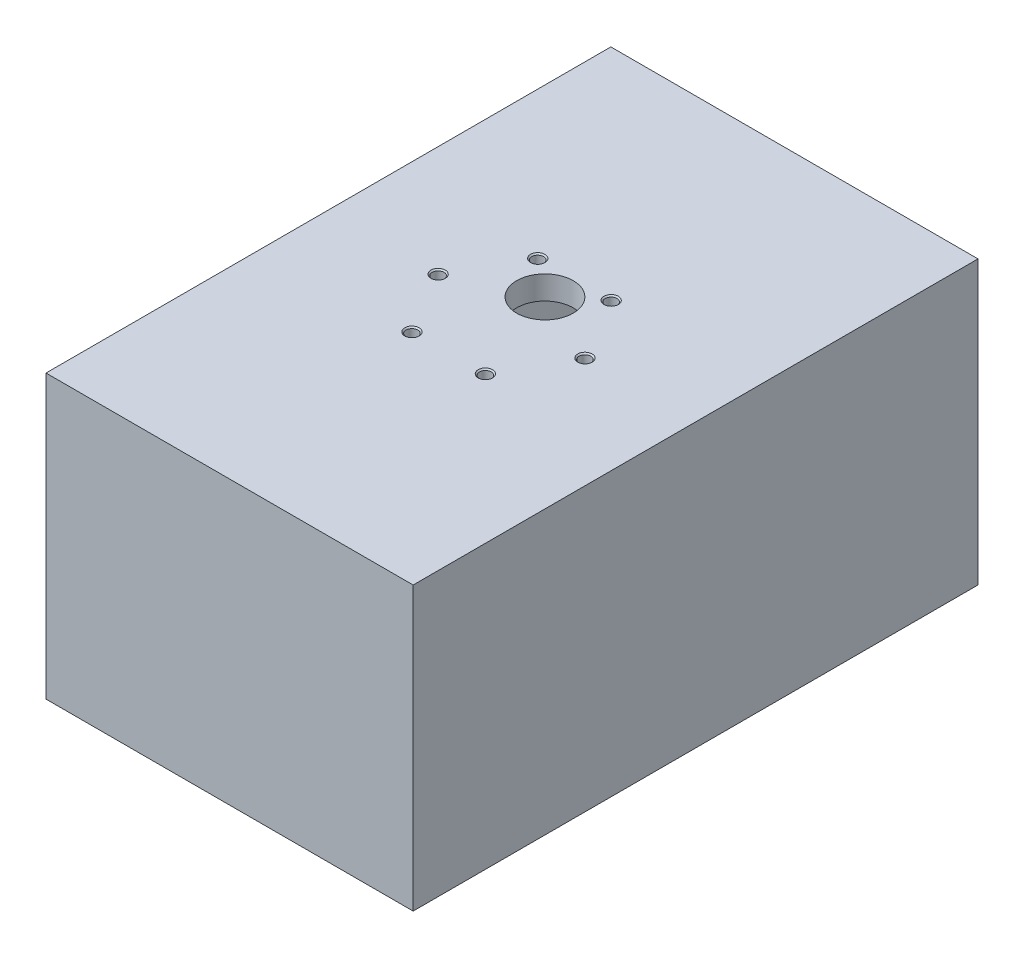
ISO-10303-21;
HEADER;
FILE_DESCRIPTION(('STEP AP214'),'2;1');
FILE_NAME('part.step','',(''),(''),'','','');
FILE_SCHEMA(('AUTOMOTIVE_DESIGN { 1 0 10303 214 1 1 1 1 }'));
ENDSEC;
DATA;
#1=APPLICATION_CONTEXT('core data for automotive mechanical design processes');
#2=APPLICATION_PROTOCOL_DEFINITION('international standard','automotive_design',2000,#1);
#3=PRODUCT_CONTEXT('',#1,'mechanical');
#4=PRODUCT('Part','Part','',(#3));
#5=PRODUCT_RELATED_PRODUCT_CATEGORY('part','',(#4));
#6=PRODUCT_DEFINITION_FORMATION('','',#4);
#7=PRODUCT_DEFINITION_CONTEXT('part definition',#1,'design');
#8=PRODUCT_DEFINITION('design','',#6,#7);
#9=PRODUCT_DEFINITION_SHAPE('','',#8);
#10=(LENGTH_UNIT() NAMED_UNIT(*) SI_UNIT(.MILLI.,.METRE.));
#11=(NAMED_UNIT(*) PLANE_ANGLE_UNIT() SI_UNIT($,.RADIAN.));
#12=(NAMED_UNIT(*) SI_UNIT($,.STERADIAN.) SOLID_ANGLE_UNIT());
#13=UNCERTAINTY_MEASURE_WITH_UNIT(LENGTH_MEASURE(1.E-05),#10,'distance_accuracy_value','');
#14=(GEOMETRIC_REPRESENTATION_CONTEXT(3) GLOBAL_UNCERTAINTY_ASSIGNED_CONTEXT((#13)) GLOBAL_UNIT_ASSIGNED_CONTEXT((#10,
#11,#12)) REPRESENTATION_CONTEXT('',''));
#15=CARTESIAN_POINT('',(0.,0.,0.));
#16=DIRECTION('',(0.,0.,1.));
#17=DIRECTION('',(1.,0.,0.));
#18=AXIS2_PLACEMENT_3D('',#15,#16,#17);
#19=CARTESIAN_POINT('',(0.,60.,0.));
#20=DIRECTION('',(0.,1.,0.));
#21=DIRECTION('',(0.,0.,1.));
#22=AXIS2_PLACEMENT_3D('',#19,#20,#21);
#23=PLANE('',#22);
#24=CARTESIAN_POINT('',(7.81807584834448,60.,13.476850013281));
#25=DIRECTION('',(0.,1.,0.));
#26=DIRECTION('',(-0.866025403784433,0.,0.50000000000001));
#27=AXIS2_PLACEMENT_3D('',#24,#25,#26);
#28=CIRCLE('',#27,1.525);
#29=CARTESIAN_POINT('',(6.49738710757322,60.,14.239350013281));
#30=VERTEX_POINT('',#29);
#31=EDGE_CURVE('E234',#30,#30,#28,.T.);
#32=ORIENTED_EDGE('',*,*,#31,.F.);
#33=EDGE_LOOP('',(#32));
#34=FACE_BOUND('',#33,.T.);
#35=CARTESIAN_POINT('',(-7.69418070197745,60.,13.5625335546426));
#36=DIRECTION('',(0.,1.,0.));
#37=DIRECTION('',(-0.866025403784443,0.,-0.499999999999992));
#38=AXIS2_PLACEMENT_3D('',#35,#36,#37);
#39=CIRCLE('',#38,1.525);
#40=CARTESIAN_POINT('',(-9.01486944274872,60.,12.8000335546426));
#41=VERTEX_POINT('',#40);
#42=EDGE_CURVE('E238',#41,#41,#39,.T.);
#43=ORIENTED_EDGE('',*,*,#42,.F.);
#44=EDGE_LOOP('',(#43));
#45=FACE_BOUND('',#44,.T.);
#46=CARTESIAN_POINT('',(-15.5245131006438,60.,0.171367082722987));
#47=DIRECTION('',(0.,1.,0.));
#48=DIRECTION('',(0.,0.,-1.));
#49=AXIS2_PLACEMENT_3D('',#46,#47,#48);
#50=CIRCLE('',#49,1.525);
#51=CARTESIAN_POINT('',(-15.5245131006438,60.,-1.35363291727701));
#52=VERTEX_POINT('',#51);
#53=EDGE_CURVE('E242',#52,#52,#50,.T.);
#54=ORIENTED_EDGE('',*,*,#53,.F.);
#55=EDGE_LOOP('',(#54));
#56=FACE_BOUND('',#55,.T.);
#57=CARTESIAN_POINT('',(-7.84258894898817,60.,-13.305482930558));
#58=DIRECTION('',(0.,1.,0.));
#59=DIRECTION('',(0.866025403784436,0.,-0.500000000000004));
#60=AXIS2_PLACEMENT_3D('',#57,#58,#59);
#61=CIRCLE('',#60,1.525);
#62=CARTESIAN_POINT('',(-6.52190020821691,60.,-14.0679829305581));
#63=VERTEX_POINT('',#62);
#64=EDGE_CURVE('E246',#63,#63,#61,.T.);
#65=ORIENTED_EDGE('',*,*,#64,.F.);
#66=EDGE_LOOP('',(#65));
#67=FACE_BOUND('',#66,.T.);
#68=CARTESIAN_POINT('',(7.66966760133375,60.,-13.3911664719196));
#69=DIRECTION('',(0.,1.,0.));
#70=DIRECTION('',(0.86602540378444,0.,0.499999999999998));
#71=AXIS2_PLACEMENT_3D('',#68,#69,#70);
#72=CIRCLE('',#71,1.525);
#73=CARTESIAN_POINT('',(8.99035634210502,60.,-12.6286664719196));
#74=VERTEX_POINT('',#73);
#75=EDGE_CURVE('E250',#74,#74,#72,.T.);
#76=ORIENTED_EDGE('',*,*,#75,.F.);
#77=EDGE_LOOP('',(#76));
#78=FACE_BOUND('',#77,.T.);
#79=CARTESIAN_POINT('',(15.5,60.,0.));
#80=DIRECTION('',(0.,1.,0.));
#81=DIRECTION('',(0.,0.,1.));
#82=AXIS2_PLACEMENT_3D('',#79,#80,#81);
#83=CIRCLE('',#82,1.525);
#84=CARTESIAN_POINT('',(15.5,60.,1.525));
#85=VERTEX_POINT('',#84);
#86=EDGE_CURVE('E254',#85,#85,#83,.T.);
#87=ORIENTED_EDGE('',*,*,#86,.F.);
#88=EDGE_LOOP('',(#87));
#89=FACE_BOUND('',#88,.T.);
#90=CARTESIAN_POINT('',(0.,60.,-7.));
#91=DIRECTION('',(0.,1.,0.));
#92=DIRECTION('',(0.,0.,1.));
#93=AXIS2_PLACEMENT_3D('',#90,#91,#92);
#94=CIRCLE('',#93,6.);
#95=CARTESIAN_POINT('',(0.,60.,-1.));
#96=VERTEX_POINT('',#95);
#97=EDGE_CURVE('E185',#96,#96,#94,.T.);
#98=ORIENTED_EDGE('',*,*,#97,.F.);
#99=EDGE_LOOP('',(#98));
#100=FACE_BOUND('',#99,.T.);
#101=DIRECTION('',(-1.,0.,0.));
#102=VECTOR('',#101,1.);
#103=CARTESIAN_POINT('',(39.,60.,-60.));
#104=LINE('',#103,#102);
#105=CARTESIAN_POINT('',(39.,60.,-60.));
#106=VERTEX_POINT('',#105);
#107=CARTESIAN_POINT('',(-39.,60.,-60.));
#108=VERTEX_POINT('',#107);
#109=EDGE_CURVE('E163',#106,#108,#104,.T.);
#110=ORIENTED_EDGE('',*,*,#109,.T.);
#111=DIRECTION('',(0.,0.,1.));
#112=VECTOR('',#111,1.);
#113=CARTESIAN_POINT('',(-39.,60.,-60.));
#114=LINE('',#113,#112);
#115=CARTESIAN_POINT('',(-39.,60.,60.));
#116=VERTEX_POINT('',#115);
#117=EDGE_CURVE('E94',#108,#116,#114,.T.);
#118=ORIENTED_EDGE('',*,*,#117,.T.);
#119=DIRECTION('',(1.,0.,0.));
#120=VECTOR('',#119,1.);
#121=CARTESIAN_POINT('',(39.,60.,60.));
#122=LINE('',#121,#120);
#123=CARTESIAN_POINT('',(39.,60.,60.));
#124=VERTEX_POINT('',#123);
#125=EDGE_CURVE('E173',#116,#124,#122,.T.);
#126=ORIENTED_EDGE('',*,*,#125,.T.);
#127=DIRECTION('',(0.,0.,-1.));
#128=VECTOR('',#127,1.);
#129=CARTESIAN_POINT('',(39.,60.,-60.));
#130=LINE('',#129,#128);
#131=EDGE_CURVE('E176',#124,#106,#130,.T.);
#132=ORIENTED_EDGE('',*,*,#131,.T.);
#133=EDGE_LOOP('',(#110,#118,#126,#132));
#134=FACE_BOUND('',#133,.T.);
#135=ADVANCED_FACE('F51',(#34,#45,#56,#67,#78,#89,#100,#134),#23,.T.);
#136=CARTESIAN_POINT('',(0.,0.,0.));
#137=DIRECTION('',(0.,1.,0.));
#138=DIRECTION('',(0.,0.,1.));
#139=AXIS2_PLACEMENT_3D('',#136,#137,#138);
#140=PLANE('',#139);
#141=DIRECTION('',(0.,0.,1.));
#142=VECTOR('',#141,1.);
#143=CARTESIAN_POINT('',(-34.,0.,0.));
#144=LINE('',#143,#142);
#145=CARTESIAN_POINT('',(-34.,0.,-55.));
#146=VERTEX_POINT('',#145);
#147=CARTESIAN_POINT('',(-34.,0.,55.));
#148=VERTEX_POINT('',#147);
#149=EDGE_CURVE('E159',#146,#148,#144,.T.);
#150=ORIENTED_EDGE('',*,*,#149,.T.);
#151=DIRECTION('',(1.,0.,0.));
#152=VECTOR('',#151,1.);
#153=CARTESIAN_POINT('',(0.,0.,55.));
#154=LINE('',#153,#152);
#155=CARTESIAN_POINT('',(34.,0.,55.));
#156=VERTEX_POINT('',#155);
#157=EDGE_CURVE('E138',#148,#156,#154,.T.);
#158=ORIENTED_EDGE('',*,*,#157,.T.);
#159=DIRECTION('',(0.,0.,-1.));
#160=VECTOR('',#159,1.);
#161=CARTESIAN_POINT('',(34.,0.,0.));
#162=LINE('',#161,#160);
#163=CARTESIAN_POINT('',(34.,0.,-55.));
#164=VERTEX_POINT('',#163);
#165=EDGE_CURVE('E155',#156,#164,#162,.T.);
#166=ORIENTED_EDGE('',*,*,#165,.T.);
#167=DIRECTION('',(-1.,0.,0.));
#168=VECTOR('',#167,1.);
#169=CARTESIAN_POINT('',(0.,0.,-55.));
#170=LINE('',#169,#168);
#171=EDGE_CURVE('E68',#164,#146,#170,.T.);
#172=ORIENTED_EDGE('',*,*,#171,.T.);
#173=EDGE_LOOP('',(#150,#158,#166,#172));
#174=FACE_BOUND('',#173,.T.);
#175=DIRECTION('',(1.,0.,0.));
#176=VECTOR('',#175,1.);
#177=CARTESIAN_POINT('',(39.,0.,60.));
#178=LINE('',#177,#176);
#179=CARTESIAN_POINT('',(-39.,0.,60.));
#180=VERTEX_POINT('',#179);
#181=CARTESIAN_POINT('',(39.,0.,60.));
#182=VERTEX_POINT('',#181);
#183=EDGE_CURVE('E162',#180,#182,#178,.T.);
#184=ORIENTED_EDGE('',*,*,#183,.F.);
#185=DIRECTION('',(0.,0.,1.));
#186=VECTOR('',#185,1.);
#187=CARTESIAN_POINT('',(-39.,0.,-60.));
#188=LINE('',#187,#186);
#189=CARTESIAN_POINT('',(-39.,0.,-60.));
#190=VERTEX_POINT('',#189);
#191=EDGE_CURVE('E96',#190,#180,#188,.T.);
#192=ORIENTED_EDGE('',*,*,#191,.F.);
#193=DIRECTION('',(-1.,0.,0.));
#194=VECTOR('',#193,1.);
#195=CARTESIAN_POINT('',(39.,0.,-60.));
#196=LINE('',#195,#194);
#197=CARTESIAN_POINT('',(39.,0.,-60.));
#198=VERTEX_POINT('',#197);
#199=EDGE_CURVE('E168',#198,#190,#196,.T.);
#200=ORIENTED_EDGE('',*,*,#199,.F.);
#201=DIRECTION('',(0.,0.,-1.));
#202=VECTOR('',#201,1.);
#203=CARTESIAN_POINT('',(39.,0.,-60.));
#204=LINE('',#203,#202);
#205=EDGE_CURVE('E166',#182,#198,#204,.T.);
#206=ORIENTED_EDGE('',*,*,#205,.F.);
#207=EDGE_LOOP('',(#184,#192,#200,#206));
#208=FACE_BOUND('',#207,.T.);
#209=ADVANCED_FACE('F53',(#174,#208),#140,.F.);
#210=CARTESIAN_POINT('',(39.,0.,-60.));
#211=DIRECTION('',(0.,0.,-1.));
#212=DIRECTION('',(-1.,0.,0.));
#213=AXIS2_PLACEMENT_3D('',#210,#211,#212);
#214=PLANE('',#213);
#215=ORIENTED_EDGE('',*,*,#109,.F.);
#216=DIRECTION('',(0.,1.,0.));
#217=VECTOR('',#216,1.);
#218=CARTESIAN_POINT('',(39.,0.,-60.));
#219=LINE('',#218,#217);
#220=EDGE_CURVE('E60',#198,#106,#219,.T.);
#221=ORIENTED_EDGE('',*,*,#220,.F.);
#222=ORIENTED_EDGE('',*,*,#199,.T.);
#223=DIRECTION('',(0.,1.,0.));
#224=VECTOR('',#223,1.);
#225=CARTESIAN_POINT('',(-39.,0.,-60.));
#226=LINE('',#225,#224);
#227=EDGE_CURVE('E11',#190,#108,#226,.T.);
#228=ORIENTED_EDGE('',*,*,#227,.T.);
#229=EDGE_LOOP('',(#215,#221,#222,#228));
#230=FACE_BOUND('',#229,.T.);
#231=ADVANCED_FACE('F203',(#230),#214,.T.);
#232=CARTESIAN_POINT('',(-39.,0.,-60.));
#233=DIRECTION('',(-1.,0.,0.));
#234=DIRECTION('',(0.,0.,1.));
#235=AXIS2_PLACEMENT_3D('',#232,#233,#234);
#236=PLANE('',#235);
#237=ORIENTED_EDGE('',*,*,#191,.T.);
#238=DIRECTION('',(0.,1.,0.));
#239=VECTOR('',#238,1.);
#240=CARTESIAN_POINT('',(-39.,0.,60.));
#241=LINE('',#240,#239);
#242=EDGE_CURVE('E171',#180,#116,#241,.T.);
#243=ORIENTED_EDGE('',*,*,#242,.T.);
#244=ORIENTED_EDGE('',*,*,#117,.F.);
#245=ORIENTED_EDGE('',*,*,#227,.F.);
#246=EDGE_LOOP('',(#237,#243,#244,#245));
#247=FACE_BOUND('',#246,.T.);
#248=ADVANCED_FACE('F211',(#247),#236,.T.);
#249=CARTESIAN_POINT('',(39.,0.,-60.));
#250=DIRECTION('',(1.,0.,0.));
#251=DIRECTION('',(0.,0.,-1.));
#252=AXIS2_PLACEMENT_3D('',#249,#250,#251);
#253=PLANE('',#252);
#254=ORIENTED_EDGE('',*,*,#205,.T.);
#255=ORIENTED_EDGE('',*,*,#220,.T.);
#256=ORIENTED_EDGE('',*,*,#131,.F.);
#257=DIRECTION('',(0.,1.,0.));
#258=VECTOR('',#257,1.);
#259=CARTESIAN_POINT('',(39.,0.,60.));
#260=LINE('',#259,#258);
#261=EDGE_CURVE('E182',#182,#124,#260,.T.);
#262=ORIENTED_EDGE('',*,*,#261,.F.);
#263=EDGE_LOOP('',(#254,#255,#256,#262));
#264=FACE_BOUND('',#263,.T.);
#265=ADVANCED_FACE('F213',(#264),#253,.T.);
#266=CARTESIAN_POINT('',(39.,0.,60.));
#267=DIRECTION('',(0.,0.,1.));
#268=DIRECTION('',(1.,0.,0.));
#269=AXIS2_PLACEMENT_3D('',#266,#267,#268);
#270=PLANE('',#269);
#271=ORIENTED_EDGE('',*,*,#125,.F.);
#272=ORIENTED_EDGE('',*,*,#242,.F.);
#273=ORIENTED_EDGE('',*,*,#183,.T.);
#274=ORIENTED_EDGE('',*,*,#261,.T.);
#275=EDGE_LOOP('',(#271,#272,#273,#274));
#276=FACE_BOUND('',#275,.T.);
#277=ADVANCED_FACE('F209',(#276),#270,.T.);
#278=CARTESIAN_POINT('',(0.,55.,0.));
#279=DIRECTION('',(0.,1.,0.));
#280=DIRECTION('',(0.,0.,1.));
#281=AXIS2_PLACEMENT_3D('',#278,#279,#280);
#282=PLANE('',#281);
#283=CARTESIAN_POINT('',(7.81807584834448,55.,13.476850013281));
#284=DIRECTION('',(0.,1.,0.));
#285=DIRECTION('',(-0.866025403784433,0.,0.50000000000001));
#286=AXIS2_PLACEMENT_3D('',#283,#284,#285);
#287=CIRCLE('',#286,1.25);
#288=CARTESIAN_POINT('',(6.73554409361394,55.,14.101850013281));
#289=VERTEX_POINT('',#288);
#290=EDGE_CURVE('E272',#289,#289,#287,.T.);
#291=ORIENTED_EDGE('',*,*,#290,.T.);
#292=EDGE_LOOP('',(#291));
#293=FACE_BOUND('',#292,.T.);
#294=CARTESIAN_POINT('',(-7.69418070197745,55.,13.5625335546426));
#295=DIRECTION('',(0.,1.,0.));
#296=DIRECTION('',(-0.866025403784443,0.,-0.499999999999992));
#297=AXIS2_PLACEMENT_3D('',#294,#295,#296);
#298=CIRCLE('',#297,1.25);
#299=CARTESIAN_POINT('',(-8.776712456708,55.,12.9375335546426));
#300=VERTEX_POINT('',#299);
#301=EDGE_CURVE('E279',#300,#300,#298,.T.);
#302=ORIENTED_EDGE('',*,*,#301,.T.);
#303=EDGE_LOOP('',(#302));
#304=FACE_BOUND('',#303,.T.);
#305=CARTESIAN_POINT('',(-15.5245131006438,55.,0.171367082722987));
#306=DIRECTION('',(0.,1.,0.));
#307=DIRECTION('',(0.,0.,-1.));
#308=AXIS2_PLACEMENT_3D('',#305,#306,#307);
#309=CIRCLE('',#308,1.25);
#310=CARTESIAN_POINT('',(-15.5245131006438,55.,-1.07863291727701));
#311=VERTEX_POINT('',#310);
#312=EDGE_CURVE('E286',#311,#311,#309,.T.);
#313=ORIENTED_EDGE('',*,*,#312,.T.);
#314=EDGE_LOOP('',(#313));
#315=FACE_BOUND('',#314,.T.);
#316=CARTESIAN_POINT('',(-7.84258894898817,55.,-13.305482930558));
#317=DIRECTION('',(0.,1.,0.));
#318=DIRECTION('',(0.866025403784436,0.,-0.500000000000004));
#319=AXIS2_PLACEMENT_3D('',#316,#317,#318);
#320=CIRCLE('',#319,1.25);
#321=CARTESIAN_POINT('',(-6.76005719425763,55.,-13.930482930558));
#322=VERTEX_POINT('',#321);
#323=EDGE_CURVE('E292',#322,#322,#320,.T.);
#324=ORIENTED_EDGE('',*,*,#323,.T.);
#325=EDGE_LOOP('',(#324));
#326=FACE_BOUND('',#325,.T.);
#327=CARTESIAN_POINT('',(7.66966760133375,55.,-13.3911664719196));
#328=DIRECTION('',(0.,1.,0.));
#329=DIRECTION('',(0.86602540378444,0.,0.499999999999998));
#330=AXIS2_PLACEMENT_3D('',#327,#328,#329);
#331=CIRCLE('',#330,1.25);
#332=CARTESIAN_POINT('',(8.7521993560643,55.,-12.7661664719196));
#333=VERTEX_POINT('',#332);
#334=EDGE_CURVE('E262',#333,#333,#331,.T.);
#335=ORIENTED_EDGE('',*,*,#334,.T.);
#336=EDGE_LOOP('',(#335));
#337=FACE_BOUND('',#336,.T.);
#338=CARTESIAN_POINT('',(15.5,55.,0.));
#339=DIRECTION('',(0.,1.,0.));
#340=DIRECTION('',(0.,0.,1.));
#341=AXIS2_PLACEMENT_3D('',#338,#339,#340);
#342=CIRCLE('',#341,1.25);
#343=CARTESIAN_POINT('',(15.5,55.,1.25));
#344=VERTEX_POINT('',#343);
#345=EDGE_CURVE('E55',#344,#344,#342,.T.);
#346=ORIENTED_EDGE('',*,*,#345,.T.);
#347=EDGE_LOOP('',(#346));
#348=FACE_BOUND('',#347,.T.);
#349=CARTESIAN_POINT('',(0.,55.,-7.));
#350=DIRECTION('',(0.,1.,0.));
#351=DIRECTION('',(0.,0.,1.));
#352=AXIS2_PLACEMENT_3D('',#349,#350,#351);
#353=CIRCLE('',#352,6.);
#354=CARTESIAN_POINT('',(0.,55.,-1.));
#355=VERTEX_POINT('',#354);
#356=EDGE_CURVE('E132',#355,#355,#353,.T.);
#357=ORIENTED_EDGE('',*,*,#356,.T.);
#358=EDGE_LOOP('',(#357));
#359=FACE_BOUND('',#358,.T.);
#360=DIRECTION('',(-1.,0.,0.));
#361=VECTOR('',#360,1.);
#362=CARTESIAN_POINT('',(0.,55.,-55.));
#363=LINE('',#362,#361);
#364=CARTESIAN_POINT('',(34.,55.,-55.));
#365=VERTEX_POINT('',#364);
#366=CARTESIAN_POINT('',(-34.,55.,-55.));
#367=VERTEX_POINT('',#366);
#368=EDGE_CURVE('E146',#365,#367,#363,.T.);
#369=ORIENTED_EDGE('',*,*,#368,.F.);
#370=DIRECTION('',(0.,0.,-1.));
#371=VECTOR('',#370,1.);
#372=CARTESIAN_POINT('',(34.,55.,0.));
#373=LINE('',#372,#371);
#374=CARTESIAN_POINT('',(34.,55.,55.));
#375=VERTEX_POINT('',#374);
#376=EDGE_CURVE('E144',#375,#365,#373,.T.);
#377=ORIENTED_EDGE('',*,*,#376,.F.);
#378=DIRECTION('',(1.,0.,0.));
#379=VECTOR('',#378,1.);
#380=CARTESIAN_POINT('',(0.,55.,55.));
#381=LINE('',#380,#379);
#382=CARTESIAN_POINT('',(-34.,55.,55.));
#383=VERTEX_POINT('',#382);
#384=EDGE_CURVE('E131',#383,#375,#381,.T.);
#385=ORIENTED_EDGE('',*,*,#384,.F.);
#386=DIRECTION('',(0.,0.,1.));
#387=VECTOR('',#386,1.);
#388=CARTESIAN_POINT('',(-34.,55.,0.));
#389=LINE('',#388,#387);
#390=EDGE_CURVE('E120',#367,#383,#389,.T.);
#391=ORIENTED_EDGE('',*,*,#390,.F.);
#392=EDGE_LOOP('',(#369,#377,#385,#391));
#393=FACE_BOUND('',#392,.T.);
#394=ADVANCED_FACE('F143',(#293,#304,#315,#326,#337,#348,#359,#393),#282,.F.);
#395=CARTESIAN_POINT('',(39.,0.,-55.));
#396=DIRECTION('',(0.,0.,-1.));
#397=DIRECTION('',(-1.,0.,0.));
#398=AXIS2_PLACEMENT_3D('',#395,#396,#397);
#399=PLANE('',#398);
#400=ORIENTED_EDGE('',*,*,#368,.T.);
#401=DIRECTION('',(0.,1.,0.));
#402=VECTOR('',#401,1.);
#403=CARTESIAN_POINT('',(-34.,0.,-55.));
#404=LINE('',#403,#402);
#405=EDGE_CURVE('E126',#146,#367,#404,.T.);
#406=ORIENTED_EDGE('',*,*,#405,.F.);
#407=ORIENTED_EDGE('',*,*,#171,.F.);
#408=DIRECTION('',(0.,1.,0.));
#409=VECTOR('',#408,1.);
#410=CARTESIAN_POINT('',(34.,0.,-55.));
#411=LINE('',#410,#409);
#412=EDGE_CURVE('E150',#164,#365,#411,.T.);
#413=ORIENTED_EDGE('',*,*,#412,.T.);
#414=EDGE_LOOP('',(#400,#406,#407,#413));
#415=FACE_BOUND('',#414,.T.);
#416=ADVANCED_FACE('F196',(#415),#399,.F.);
#417=CARTESIAN_POINT('',(-34.,0.,-60.));
#418=DIRECTION('',(-1.,0.,0.));
#419=DIRECTION('',(0.,0.,1.));
#420=AXIS2_PLACEMENT_3D('',#417,#418,#419);
#421=PLANE('',#420);
#422=ORIENTED_EDGE('',*,*,#149,.F.);
#423=ORIENTED_EDGE('',*,*,#405,.T.);
#424=ORIENTED_EDGE('',*,*,#390,.T.);
#425=DIRECTION('',(0.,1.,0.));
#426=VECTOR('',#425,1.);
#427=CARTESIAN_POINT('',(-34.,0.,55.));
#428=LINE('',#427,#426);
#429=EDGE_CURVE('E124',#148,#383,#428,.T.);
#430=ORIENTED_EDGE('',*,*,#429,.F.);
#431=EDGE_LOOP('',(#422,#423,#424,#430));
#432=FACE_BOUND('',#431,.T.);
#433=ADVANCED_FACE('F123',(#432),#421,.F.);
#434=CARTESIAN_POINT('',(34.,0.,-60.));
#435=DIRECTION('',(1.,0.,0.));
#436=DIRECTION('',(0.,0.,-1.));
#437=AXIS2_PLACEMENT_3D('',#434,#435,#436);
#438=PLANE('',#437);
#439=ORIENTED_EDGE('',*,*,#165,.F.);
#440=DIRECTION('',(0.,1.,0.));
#441=VECTOR('',#440,1.);
#442=CARTESIAN_POINT('',(34.,0.,55.));
#443=LINE('',#442,#441);
#444=EDGE_CURVE('E140',#156,#375,#443,.T.);
#445=ORIENTED_EDGE('',*,*,#444,.T.);
#446=ORIENTED_EDGE('',*,*,#376,.T.);
#447=ORIENTED_EDGE('',*,*,#412,.F.);
#448=EDGE_LOOP('',(#439,#445,#446,#447));
#449=FACE_BOUND('',#448,.T.);
#450=ADVANCED_FACE('F199',(#449),#438,.F.);
#451=CARTESIAN_POINT('',(39.,0.,55.));
#452=DIRECTION('',(0.,0.,1.));
#453=DIRECTION('',(1.,0.,0.));
#454=AXIS2_PLACEMENT_3D('',#451,#452,#453);
#455=PLANE('',#454);
#456=ORIENTED_EDGE('',*,*,#384,.T.);
#457=ORIENTED_EDGE('',*,*,#444,.F.);
#458=ORIENTED_EDGE('',*,*,#157,.F.);
#459=ORIENTED_EDGE('',*,*,#429,.T.);
#460=EDGE_LOOP('',(#456,#457,#458,#459));
#461=FACE_BOUND('',#460,.T.);
#462=ADVANCED_FACE('F136',(#461),#455,.F.);
#463=CARTESIAN_POINT('',(0.,0.,-7.));
#464=DIRECTION('',(0.,1.,0.));
#465=DIRECTION('',(0.,0.,1.));
#466=AXIS2_PLACEMENT_3D('',#463,#464,#465);
#467=CYLINDRICAL_SURFACE('',#466,6.);
#468=ORIENTED_EDGE('',*,*,#97,.T.);
#469=EDGE_LOOP('',(#468));
#470=FACE_BOUND('',#469,.T.);
#471=ORIENTED_EDGE('',*,*,#356,.F.);
#472=EDGE_LOOP('',(#471));
#473=FACE_BOUND('',#472,.T.);
#474=ADVANCED_FACE('F346',(#470,#473),#467,.F.);
#475=CARTESIAN_POINT('',(15.5,60.,0.));
#476=DIRECTION('',(0.,1.,0.));
#477=DIRECTION('',(0.,0.,1.));
#478=AXIS2_PLACEMENT_3D('',#475,#476,#477);
#479=CYLINDRICAL_SURFACE('',#478,1.25);
#480=CARTESIAN_POINT('',(15.5,59.725,0.));
#481=DIRECTION('',(0.,1.,0.));
#482=DIRECTION('',(0.,0.,1.));
#483=AXIS2_PLACEMENT_3D('',#480,#481,#482);
#484=CIRCLE('',#483,1.25);
#485=CARTESIAN_POINT('',(15.5,59.725,1.25));
#486=VERTEX_POINT('',#485);
#487=EDGE_CURVE('E193',#486,#486,#484,.T.);
#488=ORIENTED_EDGE('',*,*,#487,.T.);
#489=EDGE_LOOP('',(#488));
#490=FACE_BOUND('',#489,.T.);
#491=ORIENTED_EDGE('',*,*,#345,.F.);
#492=EDGE_LOOP('',(#491));
#493=FACE_BOUND('',#492,.T.);
#494=ADVANCED_FACE('F342',(#490,#493),#479,.F.);
#495=CARTESIAN_POINT('',(15.5,60.,0.));
#496=DIRECTION('',(0.,1.,0.));
#497=DIRECTION('',(0.,0.,1.));
#498=AXIS2_PLACEMENT_3D('',#495,#496,#497);
#499=CONICAL_SURFACE('',#498,1.525,0.785398163397455);
#500=ORIENTED_EDGE('',*,*,#487,.F.);
#501=EDGE_LOOP('',(#500));
#502=FACE_BOUND('',#501,.T.);
#503=ORIENTED_EDGE('',*,*,#86,.T.);
#504=EDGE_LOOP('',(#503));
#505=FACE_BOUND('',#504,.T.);
#506=ADVANCED_FACE('F338',(#502,#505),#499,.F.);
#507=CARTESIAN_POINT('',(7.66966760133375,60.,-13.3911664719196));
#508=DIRECTION('',(0.,1.,0.));
#509=DIRECTION('',(0.86602540378444,0.,0.499999999999998));
#510=AXIS2_PLACEMENT_3D('',#507,#508,#509);
#511=CYLINDRICAL_SURFACE('',#510,1.25);
#512=CARTESIAN_POINT('',(7.66966760133375,59.725,-13.3911664719196));
#513=DIRECTION('',(0.,1.,0.));
#514=DIRECTION('',(0.86602540378444,0.,0.499999999999998));
#515=AXIS2_PLACEMENT_3D('',#512,#513,#514);
#516=CIRCLE('',#515,1.25);
#517=CARTESIAN_POINT('',(8.7521993560643,59.725,-12.7661664719196));
#518=VERTEX_POINT('',#517);
#519=EDGE_CURVE('E259',#518,#518,#516,.T.);
#520=ORIENTED_EDGE('',*,*,#519,.T.);
#521=EDGE_LOOP('',(#520));
#522=FACE_BOUND('',#521,.T.);
#523=ORIENTED_EDGE('',*,*,#334,.F.);
#524=EDGE_LOOP('',(#523));
#525=FACE_BOUND('',#524,.T.);
#526=ADVANCED_FACE('F334',(#522,#525),#511,.F.);
#527=CARTESIAN_POINT('',(7.66966760133375,60.,-13.3911664719196));
#528=DIRECTION('',(0.,1.,0.));
#529=DIRECTION('',(0.86602540378444,0.,0.499999999999998));
#530=AXIS2_PLACEMENT_3D('',#527,#528,#529);
#531=CONICAL_SURFACE('',#530,1.525,0.785398163397455);
#532=ORIENTED_EDGE('',*,*,#519,.F.);
#533=EDGE_LOOP('',(#532));
#534=FACE_BOUND('',#533,.T.);
#535=ORIENTED_EDGE('',*,*,#75,.T.);
#536=EDGE_LOOP('',(#535));
#537=FACE_BOUND('',#536,.T.);
#538=ADVANCED_FACE('F309',(#534,#537),#531,.F.);
#539=CARTESIAN_POINT('',(-7.84258894898817,60.,-13.305482930558));
#540=DIRECTION('',(0.,1.,0.));
#541=DIRECTION('',(0.866025403784436,0.,-0.500000000000004));
#542=AXIS2_PLACEMENT_3D('',#539,#540,#541);
#543=CYLINDRICAL_SURFACE('',#542,1.25);
#544=CARTESIAN_POINT('',(-7.84258894898817,59.725,-13.305482930558));
#545=DIRECTION('',(0.,1.,0.));
#546=DIRECTION('',(0.866025403784436,0.,-0.500000000000004));
#547=AXIS2_PLACEMENT_3D('',#544,#545,#546);
#548=CIRCLE('',#547,1.25);
#549=CARTESIAN_POINT('',(-6.76005719425763,59.725,-13.9304829305581));
#550=VERTEX_POINT('',#549);
#551=EDGE_CURVE('E268',#550,#550,#548,.T.);
#552=ORIENTED_EDGE('',*,*,#551,.T.);
#553=EDGE_LOOP('',(#552));
#554=FACE_BOUND('',#553,.T.);
#555=ORIENTED_EDGE('',*,*,#323,.F.);
#556=EDGE_LOOP('',(#555));
#557=FACE_BOUND('',#556,.T.);
#558=ADVANCED_FACE('F299',(#554,#557),#543,.F.);
#559=CARTESIAN_POINT('',(-7.84258894898817,60.,-13.305482930558));
#560=DIRECTION('',(0.,1.,0.));
#561=DIRECTION('',(0.866025403784436,0.,-0.500000000000004));
#562=AXIS2_PLACEMENT_3D('',#559,#560,#561);
#563=CONICAL_SURFACE('',#562,1.525,0.785398163397455);
#564=ORIENTED_EDGE('',*,*,#551,.F.);
#565=EDGE_LOOP('',(#564));
#566=FACE_BOUND('',#565,.T.);
#567=ORIENTED_EDGE('',*,*,#64,.T.);
#568=EDGE_LOOP('',(#567));
#569=FACE_BOUND('',#568,.T.);
#570=ADVANCED_FACE('F296',(#566,#569),#563,.F.);
#571=CARTESIAN_POINT('',(-15.5245131006438,60.,0.171367082722987));
#572=DIRECTION('',(0.,1.,0.));
#573=DIRECTION('',(0.,0.,-1.));
#574=AXIS2_PLACEMENT_3D('',#571,#572,#573);
#575=CYLINDRICAL_SURFACE('',#574,1.25);
#576=CARTESIAN_POINT('',(-15.5245131006438,59.725,0.171367082722987));
#577=DIRECTION('',(0.,1.,0.));
#578=DIRECTION('',(0.,0.,-1.));
#579=AXIS2_PLACEMENT_3D('',#576,#577,#578);
#580=CIRCLE('',#579,1.25);
#581=CARTESIAN_POINT('',(-15.5245131006438,59.725,-1.07863291727701));
#582=VERTEX_POINT('',#581);
#583=EDGE_CURVE('E283',#582,#582,#580,.T.);
#584=ORIENTED_EDGE('',*,*,#583,.T.);
#585=EDGE_LOOP('',(#584));
#586=FACE_BOUND('',#585,.T.);
#587=ORIENTED_EDGE('',*,*,#312,.F.);
#588=EDGE_LOOP('',(#587));
#589=FACE_BOUND('',#588,.T.);
#590=ADVANCED_FACE('F298',(#586,#589),#575,.F.);
#591=CARTESIAN_POINT('',(-15.5245131006438,60.,0.171367082722987));
#592=DIRECTION('',(0.,1.,0.));
#593=DIRECTION('',(0.,0.,-1.));
#594=AXIS2_PLACEMENT_3D('',#591,#592,#593);
#595=CONICAL_SURFACE('',#594,1.525,0.785398163397455);
#596=ORIENTED_EDGE('',*,*,#583,.F.);
#597=EDGE_LOOP('',(#596));
#598=FACE_BOUND('',#597,.T.);
#599=ORIENTED_EDGE('',*,*,#53,.T.);
#600=EDGE_LOOP('',(#599));
#601=FACE_BOUND('',#600,.T.);
#602=ADVANCED_FACE('F305',(#598,#601),#595,.F.);
#603=CARTESIAN_POINT('',(-7.69418070197745,60.,13.5625335546426));
#604=DIRECTION('',(0.,1.,0.));
#605=DIRECTION('',(-0.866025403784443,0.,-0.499999999999992));
#606=AXIS2_PLACEMENT_3D('',#603,#604,#605);
#607=CYLINDRICAL_SURFACE('',#606,1.25);
#608=CARTESIAN_POINT('',(-7.69418070197745,59.725,13.5625335546426));
#609=DIRECTION('',(0.,1.,0.));
#610=DIRECTION('',(-0.866025403784443,0.,-0.499999999999992));
#611=AXIS2_PLACEMENT_3D('',#608,#609,#610);
#612=CIRCLE('',#611,1.25);
#613=CARTESIAN_POINT('',(-8.776712456708,59.725,12.9375335546426));
#614=VERTEX_POINT('',#613);
#615=EDGE_CURVE('E276',#614,#614,#612,.T.);
#616=ORIENTED_EDGE('',*,*,#615,.T.);
#617=EDGE_LOOP('',(#616));
#618=FACE_BOUND('',#617,.T.);
#619=ORIENTED_EDGE('',*,*,#301,.F.);
#620=EDGE_LOOP('',(#619));
#621=FACE_BOUND('',#620,.T.);
#622=ADVANCED_FACE('F314',(#618,#621),#607,.F.);
#623=CARTESIAN_POINT('',(-7.69418070197745,60.,13.5625335546426));
#624=DIRECTION('',(0.,1.,0.));
#625=DIRECTION('',(-0.866025403784443,0.,-0.499999999999992));
#626=AXIS2_PLACEMENT_3D('',#623,#624,#625);
#627=CONICAL_SURFACE('',#626,1.525,0.785398163397455);
#628=ORIENTED_EDGE('',*,*,#615,.F.);
#629=EDGE_LOOP('',(#628));
#630=FACE_BOUND('',#629,.T.);
#631=ORIENTED_EDGE('',*,*,#42,.T.);
#632=EDGE_LOOP('',(#631));
#633=FACE_BOUND('',#632,.T.);
#634=ADVANCED_FACE('F317',(#630,#633),#627,.F.);
#635=CARTESIAN_POINT('',(7.81807584834448,60.,13.476850013281));
#636=DIRECTION('',(0.,1.,0.));
#637=DIRECTION('',(-0.866025403784433,0.,0.50000000000001));
#638=AXIS2_PLACEMENT_3D('',#635,#636,#637);
#639=CYLINDRICAL_SURFACE('',#638,1.25);
#640=CARTESIAN_POINT('',(7.81807584834448,59.725,13.476850013281));
#641=DIRECTION('',(0.,1.,0.));
#642=DIRECTION('',(-0.866025403784433,0.,0.50000000000001));
#643=AXIS2_PLACEMENT_3D('',#640,#641,#642);
#644=CIRCLE('',#643,1.25);
#645=CARTESIAN_POINT('',(6.73554409361394,59.725,14.101850013281));
#646=VERTEX_POINT('',#645);
#647=EDGE_CURVE('E269',#646,#646,#644,.T.);
#648=ORIENTED_EDGE('',*,*,#647,.T.);
#649=EDGE_LOOP('',(#648));
#650=FACE_BOUND('',#649,.T.);
#651=ORIENTED_EDGE('',*,*,#290,.F.);
#652=EDGE_LOOP('',(#651));
#653=FACE_BOUND('',#652,.T.);
#654=ADVANCED_FACE('F320',(#650,#653),#639,.F.);
#655=CARTESIAN_POINT('',(7.81807584834448,60.,13.476850013281));
#656=DIRECTION('',(0.,1.,0.));
#657=DIRECTION('',(-0.866025403784433,0.,0.50000000000001));
#658=AXIS2_PLACEMENT_3D('',#655,#656,#657);
#659=CONICAL_SURFACE('',#658,1.525,0.785398163397455);
#660=ORIENTED_EDGE('',*,*,#647,.F.);
#661=EDGE_LOOP('',(#660));
#662=FACE_BOUND('',#661,.T.);
#663=ORIENTED_EDGE('',*,*,#31,.T.);
#664=EDGE_LOOP('',(#663));
#665=FACE_BOUND('',#664,.T.);
#666=ADVANCED_FACE('F325',(#662,#665),#659,.F.);
#667=CLOSED_SHELL('',(#135,#209,#231,#248,#265,#277,#394,#416,#433,#450,#462,#474,#494,#506,
#526,#538,#558,#570,#590,#602,#622,#634,#654,#666));
#668=MANIFOLD_SOLID_BREP('B2',#667);
#669=ADVANCED_BREP_SHAPE_REPRESENTATION('',(#18,#668),#14);
#670=SHAPE_DEFINITION_REPRESENTATION(#9,#669);
ENDSEC;
END-ISO-10303-21;
